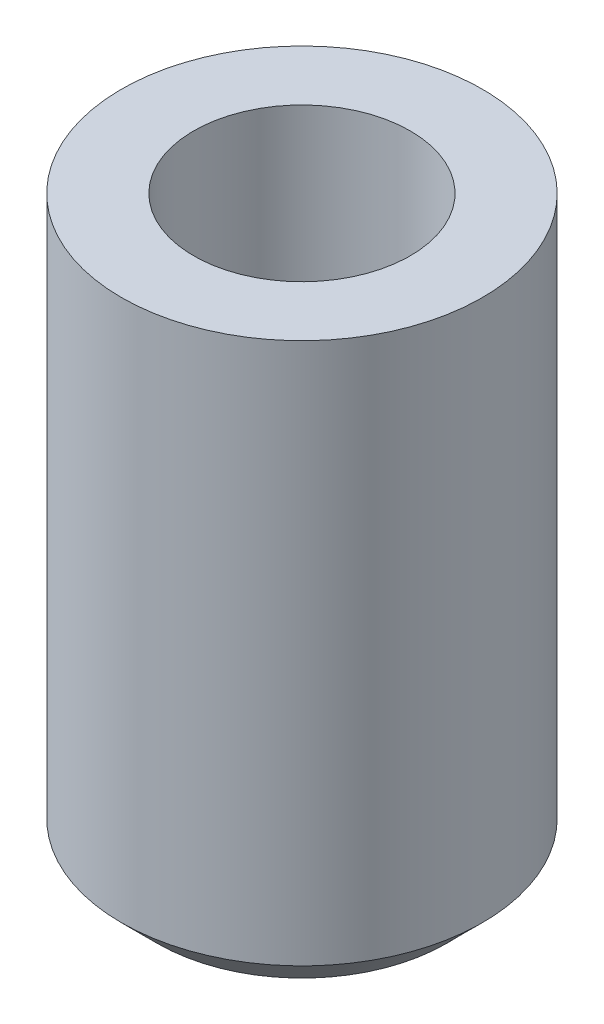
ISO-10303-21;
HEADER;
FILE_DESCRIPTION(('STEP AP214'),'2;1');
FILE_NAME('part.step','',(''),(''),'','','');
FILE_SCHEMA(('AUTOMOTIVE_DESIGN { 1 0 10303 214 1 1 1 1 }'));
ENDSEC;
DATA;
#1=APPLICATION_CONTEXT('core data for automotive mechanical design processes');
#2=APPLICATION_PROTOCOL_DEFINITION('international standard','automotive_design',2000,#1);
#3=PRODUCT_CONTEXT('',#1,'mechanical');
#4=PRODUCT('Part','Part','',(#3));
#5=PRODUCT_RELATED_PRODUCT_CATEGORY('part','',(#4));
#6=PRODUCT_DEFINITION_FORMATION('','',#4);
#7=PRODUCT_DEFINITION_CONTEXT('part definition',#1,'design');
#8=PRODUCT_DEFINITION('design','',#6,#7);
#9=PRODUCT_DEFINITION_SHAPE('','',#8);
#10=(LENGTH_UNIT() NAMED_UNIT(*) SI_UNIT(.MILLI.,.METRE.));
#11=(NAMED_UNIT(*) PLANE_ANGLE_UNIT() SI_UNIT($,.RADIAN.));
#12=(NAMED_UNIT(*) SI_UNIT($,.STERADIAN.) SOLID_ANGLE_UNIT());
#13=UNCERTAINTY_MEASURE_WITH_UNIT(LENGTH_MEASURE(1.E-05),#10,'distance_accuracy_value','');
#14=(GEOMETRIC_REPRESENTATION_CONTEXT(3) GLOBAL_UNCERTAINTY_ASSIGNED_CONTEXT((#13)) GLOBAL_UNIT_ASSIGNED_CONTEXT((#10,
#11,#12)) REPRESENTATION_CONTEXT('',''));
#15=CARTESIAN_POINT('',(0.,0.,0.));
#16=DIRECTION('',(0.,0.,1.));
#17=DIRECTION('',(1.,0.,0.));
#18=AXIS2_PLACEMENT_3D('',#15,#16,#17);
#19=CARTESIAN_POINT('',(0.,-3.,0.));
#20=DIRECTION('',(0.,1.,0.));
#21=DIRECTION('',(0.,0.,1.));
#22=AXIS2_PLACEMENT_3D('',#19,#20,#21);
#23=CONICAL_SURFACE('',#22,2.5,0.785398163397449);
#24=CARTESIAN_POINT('',(0.,-3.,0.));
#25=DIRECTION('',(0.,1.,0.));
#26=DIRECTION('',(0.,0.,1.));
#27=AXIS2_PLACEMENT_3D('',#24,#25,#26);
#28=CIRCLE('',#27,2.5);
#29=CARTESIAN_POINT('',(0.,-3.,2.5));
#30=VERTEX_POINT('',#29);
#31=EDGE_CURVE('E83',#30,#30,#28,.T.);
#32=ORIENTED_EDGE('',*,*,#31,.F.);
#33=EDGE_LOOP('',(#32));
#34=FACE_BOUND('',#33,.T.);
#35=CARTESIAN_POINT('',(0.,-3.5,0.));
#36=DIRECTION('',(0.,-1.,0.));
#37=DIRECTION('',(0.,0.,1.));
#38=AXIS2_PLACEMENT_3D('',#35,#36,#37);
#39=CIRCLE('',#38,2.);
#40=CARTESIAN_POINT('',(0.,-3.5,2.));
#41=VERTEX_POINT('',#40);
#42=EDGE_CURVE('E55',#41,#41,#39,.T.);
#43=ORIENTED_EDGE('',*,*,#42,.F.);
#44=EDGE_LOOP('',(#43));
#45=FACE_BOUND('',#44,.T.);
#46=ADVANCED_FACE('F47',(#34,#45),#23,.T.);
#47=CARTESIAN_POINT('',(0.,4.5,0.));
#48=DIRECTION('',(0.,-1.,0.));
#49=DIRECTION('',(0.,0.,-1.));
#50=AXIS2_PLACEMENT_3D('',#47,#48,#49);
#51=CYLINDRICAL_SURFACE('',#50,1.5);
#52=CARTESIAN_POINT('',(0.,-3.5,0.));
#53=DIRECTION('',(0.,-1.,0.));
#54=DIRECTION('',(0.,0.,-1.));
#55=AXIS2_PLACEMENT_3D('',#52,#53,#54);
#56=CIRCLE('',#55,1.5);
#57=CARTESIAN_POINT('',(0.,-3.5,-1.5));
#58=VERTEX_POINT('',#57);
#59=EDGE_CURVE('E11',#58,#58,#56,.T.);
#60=ORIENTED_EDGE('',*,*,#59,.T.);
#61=EDGE_LOOP('',(#60));
#62=FACE_BOUND('',#61,.T.);
#63=CARTESIAN_POINT('',(0.,4.5,0.));
#64=DIRECTION('',(0.,-1.,0.));
#65=DIRECTION('',(0.,0.,-1.));
#66=AXIS2_PLACEMENT_3D('',#63,#64,#65);
#67=CIRCLE('',#66,1.5);
#68=CARTESIAN_POINT('',(0.,4.5,-1.5));
#69=VERTEX_POINT('',#68);
#70=EDGE_CURVE('E91',#69,#69,#67,.T.);
#71=ORIENTED_EDGE('',*,*,#70,.F.);
#72=EDGE_LOOP('',(#71));
#73=FACE_BOUND('',#72,.T.);
#74=ADVANCED_FACE('F114',(#62,#73),#51,.F.);
#75=CARTESIAN_POINT('',(0.,-3.5,0.));
#76=DIRECTION('',(0.,1.,0.));
#77=DIRECTION('',(1.,0.,0.));
#78=AXIS2_PLACEMENT_3D('',#75,#76,#77);
#79=PLANE('',#78);
#80=ORIENTED_EDGE('',*,*,#59,.F.);
#81=EDGE_LOOP('',(#80));
#82=FACE_BOUND('',#81,.T.);
#83=ORIENTED_EDGE('',*,*,#42,.T.);
#84=EDGE_LOOP('',(#83));
#85=FACE_BOUND('',#84,.T.);
#86=ADVANCED_FACE('F110',(#82,#85),#79,.F.);
#87=CARTESIAN_POINT('',(0.,4.5,0.));
#88=DIRECTION('',(0.,1.,0.));
#89=DIRECTION('',(1.,0.,0.));
#90=AXIS2_PLACEMENT_3D('',#87,#88,#89);
#91=PLANE('',#90);
#92=CARTESIAN_POINT('',(0.,4.5,0.));
#93=DIRECTION('',(0.,1.,0.));
#94=DIRECTION('',(0.,0.,1.));
#95=AXIS2_PLACEMENT_3D('',#92,#93,#94);
#96=CIRCLE('',#95,2.5);
#97=CARTESIAN_POINT('',(0.,4.5,2.5));
#98=VERTEX_POINT('',#97);
#99=EDGE_CURVE('E87',#98,#98,#96,.T.);
#100=ORIENTED_EDGE('',*,*,#99,.T.);
#101=EDGE_LOOP('',(#100));
#102=FACE_BOUND('',#101,.T.);
#103=ORIENTED_EDGE('',*,*,#70,.T.);
#104=EDGE_LOOP('',(#103));
#105=FACE_BOUND('',#104,.T.);
#106=ADVANCED_FACE('F104',(#102,#105),#91,.T.);
#107=CARTESIAN_POINT('',(0.,4.5,0.));
#108=DIRECTION('',(0.,-1.,0.));
#109=DIRECTION('',(0.,0.,-1.));
#110=AXIS2_PLACEMENT_3D('',#107,#108,#109);
#111=CYLINDRICAL_SURFACE('',#110,2.5);
#112=ORIENTED_EDGE('',*,*,#99,.F.);
#113=EDGE_LOOP('',(#112));
#114=FACE_BOUND('',#113,.T.);
#115=ORIENTED_EDGE('',*,*,#31,.T.);
#116=EDGE_LOOP('',(#115));
#117=FACE_BOUND('',#116,.T.);
#118=ADVANCED_FACE('F84',(#114,#117),#111,.T.);
#119=CLOSED_SHELL('',(#46,#74,#86,#106,#118));
#120=MANIFOLD_SOLID_BREP('B2',#119);
#121=ADVANCED_BREP_SHAPE_REPRESENTATION('',(#18,#120),#14);
#122=SHAPE_DEFINITION_REPRESENTATION(#9,#121);
ENDSEC;
END-ISO-10303-21;
